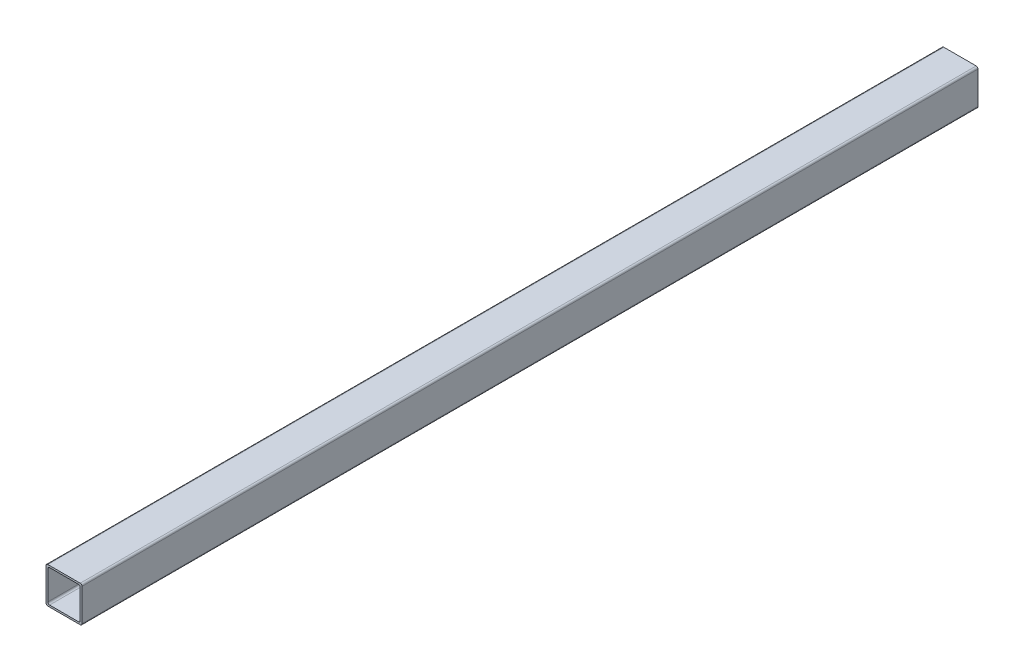
ISO-10303-21;
HEADER;
FILE_DESCRIPTION(('STEP AP214'),'2;1');
FILE_NAME('part.step','',(''),(''),'','','');
FILE_SCHEMA(('AUTOMOTIVE_DESIGN { 1 0 10303 214 1 1 1 1 }'));
ENDSEC;
DATA;
#1=APPLICATION_CONTEXT('core data for automotive mechanical design processes');
#2=APPLICATION_PROTOCOL_DEFINITION('international standard','automotive_design',2000,#1);
#3=PRODUCT_CONTEXT('',#1,'mechanical');
#4=PRODUCT('Part','Part','',(#3));
#5=PRODUCT_RELATED_PRODUCT_CATEGORY('part','',(#4));
#6=PRODUCT_DEFINITION_FORMATION('','',#4);
#7=PRODUCT_DEFINITION_CONTEXT('part definition',#1,'design');
#8=PRODUCT_DEFINITION('design','',#6,#7);
#9=PRODUCT_DEFINITION_SHAPE('','',#8);
#10=(LENGTH_UNIT() NAMED_UNIT(*) SI_UNIT(.MILLI.,.METRE.));
#11=(NAMED_UNIT(*) PLANE_ANGLE_UNIT() SI_UNIT($,.RADIAN.));
#12=(NAMED_UNIT(*) SI_UNIT($,.STERADIAN.) SOLID_ANGLE_UNIT());
#13=UNCERTAINTY_MEASURE_WITH_UNIT(LENGTH_MEASURE(1.E-05),#10,'distance_accuracy_value','');
#14=(GEOMETRIC_REPRESENTATION_CONTEXT(3) GLOBAL_UNCERTAINTY_ASSIGNED_CONTEXT((#13)) GLOBAL_UNIT_ASSIGNED_CONTEXT((#10,
#11,#12)) REPRESENTATION_CONTEXT('',''));
#15=CARTESIAN_POINT('',(0.,0.,0.));
#16=DIRECTION('',(0.,0.,1.));
#17=DIRECTION('',(1.,0.,0.));
#18=AXIS2_PLACEMENT_3D('',#15,#16,#17);
#19=CARTESIAN_POINT('',(18.,18.,995.));
#20=DIRECTION('',(0.,0.,-1.));
#21=DIRECTION('',(-1.,0.,0.));
#22=AXIS2_PLACEMENT_3D('',#19,#20,#21);
#23=PLANE('',#22);
#24=CARTESIAN_POINT('',(18.,18.,995.));
#25=DIRECTION('',(0.,0.,1.));
#26=DIRECTION('',(-1.,0.,0.));
#27=AXIS2_PLACEMENT_3D('',#24,#25,#26);
#28=CIRCLE('',#27,2.);
#29=CARTESIAN_POINT('',(20.,18.,995.));
#30=VERTEX_POINT('',#29);
#31=CARTESIAN_POINT('',(18.,20.,995.));
#32=VERTEX_POINT('',#31);
#33=EDGE_CURVE('E213',#30,#32,#28,.T.);
#34=ORIENTED_EDGE('',*,*,#33,.T.);
#35=DIRECTION('',(-1.,0.,0.));
#36=VECTOR('',#35,1.);
#37=CARTESIAN_POINT('',(-18.,20.,995.));
#38=LINE('',#37,#36);
#39=CARTESIAN_POINT('',(-18.,20.,995.));
#40=VERTEX_POINT('',#39);
#41=EDGE_CURVE('E216',#32,#40,#38,.T.);
#42=ORIENTED_EDGE('',*,*,#41,.T.);
#43=CARTESIAN_POINT('',(-18.,18.,995.));
#44=DIRECTION('',(0.,0.,1.));
#45=DIRECTION('',(1.,0.,0.));
#46=AXIS2_PLACEMENT_3D('',#43,#44,#45);
#47=CIRCLE('',#46,2.);
#48=CARTESIAN_POINT('',(-20.,18.,995.));
#49=VERTEX_POINT('',#48);
#50=EDGE_CURVE('E219',#40,#49,#47,.T.);
#51=ORIENTED_EDGE('',*,*,#50,.T.);
#52=DIRECTION('',(0.,-1.,0.));
#53=VECTOR('',#52,1.);
#54=CARTESIAN_POINT('',(-20.,18.,995.));
#55=LINE('',#54,#53);
#56=CARTESIAN_POINT('',(-20.,-18.,995.));
#57=VERTEX_POINT('',#56);
#58=EDGE_CURVE('E221',#49,#57,#55,.T.);
#59=ORIENTED_EDGE('',*,*,#58,.T.);
#60=CARTESIAN_POINT('',(-18.,-18.,995.));
#61=DIRECTION('',(0.,0.,1.));
#62=DIRECTION('',(1.,0.,0.));
#63=AXIS2_PLACEMENT_3D('',#60,#61,#62);
#64=CIRCLE('',#63,2.);
#65=CARTESIAN_POINT('',(-18.,-20.,995.));
#66=VERTEX_POINT('',#65);
#67=EDGE_CURVE('E223',#57,#66,#64,.T.);
#68=ORIENTED_EDGE('',*,*,#67,.T.);
#69=DIRECTION('',(1.,0.,0.));
#70=VECTOR('',#69,1.);
#71=CARTESIAN_POINT('',(-18.,-20.,995.));
#72=LINE('',#71,#70);
#73=CARTESIAN_POINT('',(18.,-20.,995.));
#74=VERTEX_POINT('',#73);
#75=EDGE_CURVE('E225',#66,#74,#72,.T.);
#76=ORIENTED_EDGE('',*,*,#75,.T.);
#77=CARTESIAN_POINT('',(18.,-18.,995.));
#78=DIRECTION('',(0.,0.,1.));
#79=DIRECTION('',(1.,0.,0.));
#80=AXIS2_PLACEMENT_3D('',#77,#78,#79);
#81=CIRCLE('',#80,2.);
#82=CARTESIAN_POINT('',(20.,-18.,995.));
#83=VERTEX_POINT('',#82);
#84=EDGE_CURVE('E227',#74,#83,#81,.T.);
#85=ORIENTED_EDGE('',*,*,#84,.T.);
#86=DIRECTION('',(0.,1.,0.));
#87=VECTOR('',#86,1.);
#88=CARTESIAN_POINT('',(20.,18.,995.));
#89=LINE('',#88,#87);
#90=EDGE_CURVE('E229',#83,#30,#89,.T.);
#91=ORIENTED_EDGE('',*,*,#90,.T.);
#92=EDGE_LOOP('',(#34,#42,#51,#59,#68,#76,#85,#91));
#93=FACE_BOUND('',#92,.T.);
#94=CARTESIAN_POINT('',(16.,16.,995.));
#95=DIRECTION('',(0.,0.,1.));
#96=DIRECTION('',(1.,0.,0.));
#97=AXIS2_PLACEMENT_3D('',#94,#95,#96);
#98=CIRCLE('',#97,2.);
#99=CARTESIAN_POINT('',(18.,16.,995.));
#100=VERTEX_POINT('',#99);
#101=CARTESIAN_POINT('',(16.,18.,995.));
#102=VERTEX_POINT('',#101);
#103=EDGE_CURVE('E148',#100,#102,#98,.T.);
#104=ORIENTED_EDGE('',*,*,#103,.F.);
#105=DIRECTION('',(0.,1.,0.));
#106=VECTOR('',#105,1.);
#107=CARTESIAN_POINT('',(18.,-16.,995.));
#108=LINE('',#107,#106);
#109=CARTESIAN_POINT('',(18.,-16.,995.));
#110=VERTEX_POINT('',#109);
#111=EDGE_CURVE('E181',#110,#100,#108,.T.);
#112=ORIENTED_EDGE('',*,*,#111,.F.);
#113=CARTESIAN_POINT('',(16.,-16.,995.));
#114=DIRECTION('',(0.,0.,1.));
#115=DIRECTION('',(1.,0.,0.));
#116=AXIS2_PLACEMENT_3D('',#113,#114,#115);
#117=CIRCLE('',#116,2.);
#118=CARTESIAN_POINT('',(16.,-18.,995.));
#119=VERTEX_POINT('',#118);
#120=EDGE_CURVE('E179',#119,#110,#117,.T.);
#121=ORIENTED_EDGE('',*,*,#120,.F.);
#122=DIRECTION('',(1.,0.,0.));
#123=VECTOR('',#122,1.);
#124=CARTESIAN_POINT('',(16.,-18.,995.));
#125=LINE('',#124,#123);
#126=CARTESIAN_POINT('',(-16.,-18.,995.));
#127=VERTEX_POINT('',#126);
#128=EDGE_CURVE('E177',#127,#119,#125,.T.);
#129=ORIENTED_EDGE('',*,*,#128,.F.);
#130=CARTESIAN_POINT('',(-16.,-16.,995.));
#131=DIRECTION('',(0.,0.,1.));
#132=DIRECTION('',(-1.,0.,0.));
#133=AXIS2_PLACEMENT_3D('',#130,#131,#132);
#134=CIRCLE('',#133,2.);
#135=CARTESIAN_POINT('',(-18.,-16.,995.));
#136=VERTEX_POINT('',#135);
#137=EDGE_CURVE('E175',#136,#127,#134,.T.);
#138=ORIENTED_EDGE('',*,*,#137,.F.);
#139=DIRECTION('',(0.,-1.,0.));
#140=VECTOR('',#139,1.);
#141=CARTESIAN_POINT('',(-18.,-16.,995.));
#142=LINE('',#141,#140);
#143=CARTESIAN_POINT('',(-18.,16.,995.));
#144=VERTEX_POINT('',#143);
#145=EDGE_CURVE('E171',#144,#136,#142,.T.);
#146=ORIENTED_EDGE('',*,*,#145,.F.);
#147=CARTESIAN_POINT('',(-16.,16.,995.));
#148=DIRECTION('',(0.,0.,1.));
#149=DIRECTION('',(1.,0.,0.));
#150=AXIS2_PLACEMENT_3D('',#147,#148,#149);
#151=CIRCLE('',#150,2.);
#152=CARTESIAN_POINT('',(-16.,18.,995.));
#153=VERTEX_POINT('',#152);
#154=EDGE_CURVE('E169',#153,#144,#151,.T.);
#155=ORIENTED_EDGE('',*,*,#154,.F.);
#156=DIRECTION('',(-1.,0.,0.));
#157=VECTOR('',#156,1.);
#158=CARTESIAN_POINT('',(16.,18.,995.));
#159=LINE('',#158,#157);
#160=EDGE_CURVE('E156',#102,#153,#159,.T.);
#161=ORIENTED_EDGE('',*,*,#160,.F.);
#162=EDGE_LOOP('',(#104,#112,#121,#129,#138,#146,#155,#161));
#163=FACE_BOUND('',#162,.T.);
#164=ADVANCED_FACE('F35',(#93,#163),#23,.F.);
#165=CARTESIAN_POINT('',(18.,18.,0.));
#166=DIRECTION('',(0.,0.,-1.));
#167=DIRECTION('',(-1.,0.,0.));
#168=AXIS2_PLACEMENT_3D('',#165,#166,#167);
#169=PLANE('',#168);
#170=CARTESIAN_POINT('',(18.,18.,0.));
#171=DIRECTION('',(0.,0.,1.));
#172=DIRECTION('',(-1.,0.,0.));
#173=AXIS2_PLACEMENT_3D('',#170,#171,#172);
#174=CIRCLE('',#173,2.);
#175=CARTESIAN_POINT('',(20.,18.,0.));
#176=VERTEX_POINT('',#175);
#177=CARTESIAN_POINT('',(18.,20.,0.));
#178=VERTEX_POINT('',#177);
#179=EDGE_CURVE('E164',#176,#178,#174,.T.);
#180=ORIENTED_EDGE('',*,*,#179,.F.);
#181=DIRECTION('',(0.,1.,0.));
#182=VECTOR('',#181,1.);
#183=CARTESIAN_POINT('',(20.,18.,0.));
#184=LINE('',#183,#182);
#185=CARTESIAN_POINT('',(20.,-18.,0.));
#186=VERTEX_POINT('',#185);
#187=EDGE_CURVE('E217',#186,#176,#184,.T.);
#188=ORIENTED_EDGE('',*,*,#187,.F.);
#189=CARTESIAN_POINT('',(18.,-18.,0.));
#190=DIRECTION('',(0.,0.,1.));
#191=DIRECTION('',(1.,0.,0.));
#192=AXIS2_PLACEMENT_3D('',#189,#190,#191);
#193=CIRCLE('',#192,2.);
#194=CARTESIAN_POINT('',(18.,-20.,0.));
#195=VERTEX_POINT('',#194);
#196=EDGE_CURVE('E244',#195,#186,#193,.T.);
#197=ORIENTED_EDGE('',*,*,#196,.F.);
#198=DIRECTION('',(1.,0.,0.));
#199=VECTOR('',#198,1.);
#200=CARTESIAN_POINT('',(-18.,-20.,0.));
#201=LINE('',#200,#199);
#202=CARTESIAN_POINT('',(-18.,-20.,0.));
#203=VERTEX_POINT('',#202);
#204=EDGE_CURVE('E242',#203,#195,#201,.T.);
#205=ORIENTED_EDGE('',*,*,#204,.F.);
#206=CARTESIAN_POINT('',(-18.,-18.,0.));
#207=DIRECTION('',(0.,0.,1.));
#208=DIRECTION('',(1.,0.,0.));
#209=AXIS2_PLACEMENT_3D('',#206,#207,#208);
#210=CIRCLE('',#209,2.);
#211=CARTESIAN_POINT('',(-20.,-18.,0.));
#212=VERTEX_POINT('',#211);
#213=EDGE_CURVE('E240',#212,#203,#210,.T.);
#214=ORIENTED_EDGE('',*,*,#213,.F.);
#215=DIRECTION('',(0.,-1.,0.));
#216=VECTOR('',#215,1.);
#217=CARTESIAN_POINT('',(-20.,18.,0.));
#218=LINE('',#217,#216);
#219=CARTESIAN_POINT('',(-20.,18.,0.));
#220=VERTEX_POINT('',#219);
#221=EDGE_CURVE('E238',#220,#212,#218,.T.);
#222=ORIENTED_EDGE('',*,*,#221,.F.);
#223=CARTESIAN_POINT('',(-18.,18.,0.));
#224=DIRECTION('',(0.,0.,1.));
#225=DIRECTION('',(1.,0.,0.));
#226=AXIS2_PLACEMENT_3D('',#223,#224,#225);
#227=CIRCLE('',#226,2.);
#228=CARTESIAN_POINT('',(-18.,20.,0.));
#229=VERTEX_POINT('',#228);
#230=EDGE_CURVE('E236',#229,#220,#227,.T.);
#231=ORIENTED_EDGE('',*,*,#230,.F.);
#232=DIRECTION('',(-1.,0.,0.));
#233=VECTOR('',#232,1.);
#234=CARTESIAN_POINT('',(-18.,20.,0.));
#235=LINE('',#234,#233);
#236=EDGE_CURVE('E234',#178,#229,#235,.T.);
#237=ORIENTED_EDGE('',*,*,#236,.F.);
#238=EDGE_LOOP('',(#180,#188,#197,#205,#214,#222,#231,#237));
#239=FACE_BOUND('',#238,.T.);
#240=DIRECTION('',(0.,1.,0.));
#241=VECTOR('',#240,1.);
#242=CARTESIAN_POINT('',(18.,-16.,0.));
#243=LINE('',#242,#241);
#244=CARTESIAN_POINT('',(18.,-16.,0.));
#245=VERTEX_POINT('',#244);
#246=CARTESIAN_POINT('',(18.,16.,0.));
#247=VERTEX_POINT('',#246);
#248=EDGE_CURVE('E157',#245,#247,#243,.T.);
#249=ORIENTED_EDGE('',*,*,#248,.T.);
#250=CARTESIAN_POINT('',(16.,16.,0.));
#251=DIRECTION('',(0.,0.,1.));
#252=DIRECTION('',(1.,0.,0.));
#253=AXIS2_PLACEMENT_3D('',#250,#251,#252);
#254=CIRCLE('',#253,2.);
#255=CARTESIAN_POINT('',(16.,18.,0.));
#256=VERTEX_POINT('',#255);
#257=EDGE_CURVE('E58',#247,#256,#254,.T.);
#258=ORIENTED_EDGE('',*,*,#257,.T.);
#259=DIRECTION('',(-1.,0.,0.));
#260=VECTOR('',#259,1.);
#261=CARTESIAN_POINT('',(16.,18.,0.));
#262=LINE('',#261,#260);
#263=CARTESIAN_POINT('',(-16.,18.,0.));
#264=VERTEX_POINT('',#263);
#265=EDGE_CURVE('E163',#256,#264,#262,.T.);
#266=ORIENTED_EDGE('',*,*,#265,.T.);
#267=CARTESIAN_POINT('',(-16.,16.,0.));
#268=DIRECTION('',(0.,0.,1.));
#269=DIRECTION('',(1.,0.,0.));
#270=AXIS2_PLACEMENT_3D('',#267,#268,#269);
#271=CIRCLE('',#270,2.);
#272=CARTESIAN_POINT('',(-18.,16.,0.));
#273=VERTEX_POINT('',#272);
#274=EDGE_CURVE('E185',#264,#273,#271,.T.);
#275=ORIENTED_EDGE('',*,*,#274,.T.);
#276=DIRECTION('',(0.,-1.,0.));
#277=VECTOR('',#276,1.);
#278=CARTESIAN_POINT('',(-18.,-16.,0.));
#279=LINE('',#278,#277);
#280=CARTESIAN_POINT('',(-18.,-16.,0.));
#281=VERTEX_POINT('',#280);
#282=EDGE_CURVE('E188',#273,#281,#279,.T.);
#283=ORIENTED_EDGE('',*,*,#282,.T.);
#284=CARTESIAN_POINT('',(-16.,-16.,0.));
#285=DIRECTION('',(0.,0.,1.));
#286=DIRECTION('',(-1.,0.,0.));
#287=AXIS2_PLACEMENT_3D('',#284,#285,#286);
#288=CIRCLE('',#287,2.);
#289=CARTESIAN_POINT('',(-16.,-18.,0.));
#290=VERTEX_POINT('',#289);
#291=EDGE_CURVE('E191',#281,#290,#288,.T.);
#292=ORIENTED_EDGE('',*,*,#291,.T.);
#293=DIRECTION('',(1.,0.,0.));
#294=VECTOR('',#293,1.);
#295=CARTESIAN_POINT('',(16.,-18.,0.));
#296=LINE('',#295,#294);
#297=CARTESIAN_POINT('',(16.,-18.,0.));
#298=VERTEX_POINT('',#297);
#299=EDGE_CURVE('E194',#290,#298,#296,.T.);
#300=ORIENTED_EDGE('',*,*,#299,.T.);
#301=CARTESIAN_POINT('',(16.,-16.,0.));
#302=DIRECTION('',(0.,0.,1.));
#303=DIRECTION('',(1.,0.,0.));
#304=AXIS2_PLACEMENT_3D('',#301,#302,#303);
#305=CIRCLE('',#304,2.);
#306=EDGE_CURVE('E197',#298,#245,#305,.T.);
#307=ORIENTED_EDGE('',*,*,#306,.T.);
#308=EDGE_LOOP('',(#249,#258,#266,#275,#283,#292,#300,#307));
#309=FACE_BOUND('',#308,.T.);
#310=ADVANCED_FACE('F274',(#239,#309),#169,.T.);
#311=CARTESIAN_POINT('',(18.,18.,995.));
#312=DIRECTION('',(0.,0.,-1.));
#313=DIRECTION('',(-1.,0.,0.));
#314=AXIS2_PLACEMENT_3D('',#311,#312,#313);
#315=CYLINDRICAL_SURFACE('',#314,2.);
#316=ORIENTED_EDGE('',*,*,#179,.T.);
#317=DIRECTION('',(0.,0.,-1.));
#318=VECTOR('',#317,1.);
#319=CARTESIAN_POINT('',(18.,20.,995.));
#320=LINE('',#319,#318);
#321=EDGE_CURVE('E11',#32,#178,#320,.T.);
#322=ORIENTED_EDGE('',*,*,#321,.F.);
#323=ORIENTED_EDGE('',*,*,#33,.F.);
#324=DIRECTION('',(0.,0.,-1.));
#325=VECTOR('',#324,1.);
#326=CARTESIAN_POINT('',(20.,18.,995.));
#327=LINE('',#326,#325);
#328=EDGE_CURVE('E231',#30,#176,#327,.T.);
#329=ORIENTED_EDGE('',*,*,#328,.T.);
#330=EDGE_LOOP('',(#316,#322,#323,#329));
#331=FACE_BOUND('',#330,.T.);
#332=ADVANCED_FACE('F37',(#331),#315,.T.);
#333=CARTESIAN_POINT('',(-18.,20.,995.));
#334=DIRECTION('',(0.,-1.,0.));
#335=DIRECTION('',(0.,0.,-1.));
#336=AXIS2_PLACEMENT_3D('',#333,#334,#335);
#337=PLANE('',#336);
#338=ORIENTED_EDGE('',*,*,#236,.T.);
#339=DIRECTION('',(0.,0.,-1.));
#340=VECTOR('',#339,1.);
#341=CARTESIAN_POINT('',(-18.,20.,995.));
#342=LINE('',#341,#340);
#343=EDGE_CURVE('E43',#40,#229,#342,.T.);
#344=ORIENTED_EDGE('',*,*,#343,.F.);
#345=ORIENTED_EDGE('',*,*,#41,.F.);
#346=ORIENTED_EDGE('',*,*,#321,.T.);
#347=EDGE_LOOP('',(#338,#344,#345,#346));
#348=FACE_BOUND('',#347,.T.);
#349=ADVANCED_FACE('F291',(#348),#337,.F.);
#350=CARTESIAN_POINT('',(-18.,18.,995.));
#351=DIRECTION('',(0.,0.,-1.));
#352=DIRECTION('',(-1.,0.,0.));
#353=AXIS2_PLACEMENT_3D('',#350,#351,#352);
#354=CYLINDRICAL_SURFACE('',#353,2.);
#355=ORIENTED_EDGE('',*,*,#230,.T.);
#356=DIRECTION('',(0.,0.,-1.));
#357=VECTOR('',#356,1.);
#358=CARTESIAN_POINT('',(-20.,18.,995.));
#359=LINE('',#358,#357);
#360=EDGE_CURVE('E261',#49,#220,#359,.T.);
#361=ORIENTED_EDGE('',*,*,#360,.F.);
#362=ORIENTED_EDGE('',*,*,#50,.F.);
#363=ORIENTED_EDGE('',*,*,#343,.T.);
#364=EDGE_LOOP('',(#355,#361,#362,#363));
#365=FACE_BOUND('',#364,.T.);
#366=ADVANCED_FACE('F268',(#365),#354,.T.);
#367=CARTESIAN_POINT('',(-20.,18.,995.));
#368=DIRECTION('',(1.,0.,0.));
#369=DIRECTION('',(0.,0.,-1.));
#370=AXIS2_PLACEMENT_3D('',#367,#368,#369);
#371=PLANE('',#370);
#372=ORIENTED_EDGE('',*,*,#221,.T.);
#373=DIRECTION('',(0.,0.,-1.));
#374=VECTOR('',#373,1.);
#375=CARTESIAN_POINT('',(-20.,-18.,995.));
#376=LINE('',#375,#374);
#377=EDGE_CURVE('E258',#57,#212,#376,.T.);
#378=ORIENTED_EDGE('',*,*,#377,.F.);
#379=ORIENTED_EDGE('',*,*,#58,.F.);
#380=ORIENTED_EDGE('',*,*,#360,.T.);
#381=EDGE_LOOP('',(#372,#378,#379,#380));
#382=FACE_BOUND('',#381,.T.);
#383=ADVANCED_FACE('F280',(#382),#371,.F.);
#384=CARTESIAN_POINT('',(-18.,-18.,995.));
#385=DIRECTION('',(0.,0.,-1.));
#386=DIRECTION('',(-1.,0.,0.));
#387=AXIS2_PLACEMENT_3D('',#384,#385,#386);
#388=CYLINDRICAL_SURFACE('',#387,2.);
#389=ORIENTED_EDGE('',*,*,#213,.T.);
#390=DIRECTION('',(0.,0.,-1.));
#391=VECTOR('',#390,1.);
#392=CARTESIAN_POINT('',(-18.,-20.,995.));
#393=LINE('',#392,#391);
#394=EDGE_CURVE('E255',#66,#203,#393,.T.);
#395=ORIENTED_EDGE('',*,*,#394,.F.);
#396=ORIENTED_EDGE('',*,*,#67,.F.);
#397=ORIENTED_EDGE('',*,*,#377,.T.);
#398=EDGE_LOOP('',(#389,#395,#396,#397));
#399=FACE_BOUND('',#398,.T.);
#400=ADVANCED_FACE('F284',(#399),#388,.T.);
#401=CARTESIAN_POINT('',(-18.,-20.,995.));
#402=DIRECTION('',(0.,1.,0.));
#403=DIRECTION('',(0.,0.,1.));
#404=AXIS2_PLACEMENT_3D('',#401,#402,#403);
#405=PLANE('',#404);
#406=ORIENTED_EDGE('',*,*,#204,.T.);
#407=DIRECTION('',(0.,0.,-1.));
#408=VECTOR('',#407,1.);
#409=CARTESIAN_POINT('',(18.,-20.,995.));
#410=LINE('',#409,#408);
#411=EDGE_CURVE('E252',#74,#195,#410,.T.);
#412=ORIENTED_EDGE('',*,*,#411,.F.);
#413=ORIENTED_EDGE('',*,*,#75,.F.);
#414=ORIENTED_EDGE('',*,*,#394,.T.);
#415=EDGE_LOOP('',(#406,#412,#413,#414));
#416=FACE_BOUND('',#415,.T.);
#417=ADVANCED_FACE('F304',(#416),#405,.F.);
#418=CARTESIAN_POINT('',(18.,-18.,995.));
#419=DIRECTION('',(0.,0.,-1.));
#420=DIRECTION('',(-1.,0.,0.));
#421=AXIS2_PLACEMENT_3D('',#418,#419,#420);
#422=CYLINDRICAL_SURFACE('',#421,2.);
#423=ORIENTED_EDGE('',*,*,#196,.T.);
#424=DIRECTION('',(0.,0.,-1.));
#425=VECTOR('',#424,1.);
#426=CARTESIAN_POINT('',(20.,-18.,995.));
#427=LINE('',#426,#425);
#428=EDGE_CURVE('E249',#83,#186,#427,.T.);
#429=ORIENTED_EDGE('',*,*,#428,.F.);
#430=ORIENTED_EDGE('',*,*,#84,.F.);
#431=ORIENTED_EDGE('',*,*,#411,.T.);
#432=EDGE_LOOP('',(#423,#429,#430,#431));
#433=FACE_BOUND('',#432,.T.);
#434=ADVANCED_FACE('F302',(#433),#422,.T.);
#435=CARTESIAN_POINT('',(20.,18.,995.));
#436=DIRECTION('',(-1.,0.,0.));
#437=DIRECTION('',(0.,0.,1.));
#438=AXIS2_PLACEMENT_3D('',#435,#436,#437);
#439=PLANE('',#438);
#440=ORIENTED_EDGE('',*,*,#187,.T.);
#441=ORIENTED_EDGE('',*,*,#328,.F.);
#442=ORIENTED_EDGE('',*,*,#90,.F.);
#443=ORIENTED_EDGE('',*,*,#428,.T.);
#444=EDGE_LOOP('',(#440,#441,#442,#443));
#445=FACE_BOUND('',#444,.T.);
#446=ADVANCED_FACE('F297',(#445),#439,.F.);
#447=CARTESIAN_POINT('',(16.,16.,995.));
#448=DIRECTION('',(0.,0.,-1.));
#449=DIRECTION('',(-1.,0.,0.));
#450=AXIS2_PLACEMENT_3D('',#447,#448,#449);
#451=CYLINDRICAL_SURFACE('',#450,2.);
#452=ORIENTED_EDGE('',*,*,#257,.F.);
#453=DIRECTION('',(0.,0.,-1.));
#454=VECTOR('',#453,1.);
#455=CARTESIAN_POINT('',(18.,16.,995.));
#456=LINE('',#455,#454);
#457=EDGE_CURVE('E152',#100,#247,#456,.T.);
#458=ORIENTED_EDGE('',*,*,#457,.F.);
#459=ORIENTED_EDGE('',*,*,#103,.T.);
#460=DIRECTION('',(0.,0.,-1.));
#461=VECTOR('',#460,1.);
#462=CARTESIAN_POINT('',(16.,18.,995.));
#463=LINE('',#462,#461);
#464=EDGE_CURVE('E151',#102,#256,#463,.T.);
#465=ORIENTED_EDGE('',*,*,#464,.T.);
#466=EDGE_LOOP('',(#452,#458,#459,#465));
#467=FACE_BOUND('',#466,.T.);
#468=ADVANCED_FACE('F150',(#467),#451,.F.);
#469=CARTESIAN_POINT('',(16.,18.,995.));
#470=DIRECTION('',(0.,-1.,0.));
#471=DIRECTION('',(0.,0.,-1.));
#472=AXIS2_PLACEMENT_3D('',#469,#470,#471);
#473=PLANE('',#472);
#474=ORIENTED_EDGE('',*,*,#265,.F.);
#475=ORIENTED_EDGE('',*,*,#464,.F.);
#476=ORIENTED_EDGE('',*,*,#160,.T.);
#477=DIRECTION('',(0.,0.,-1.));
#478=VECTOR('',#477,1.);
#479=CARTESIAN_POINT('',(-16.,18.,995.));
#480=LINE('',#479,#478);
#481=EDGE_CURVE('E165',#153,#264,#480,.T.);
#482=ORIENTED_EDGE('',*,*,#481,.T.);
#483=EDGE_LOOP('',(#474,#475,#476,#482));
#484=FACE_BOUND('',#483,.T.);
#485=ADVANCED_FACE('F160',(#484),#473,.T.);
#486=CARTESIAN_POINT('',(-16.,16.,995.));
#487=DIRECTION('',(0.,0.,-1.));
#488=DIRECTION('',(-1.,0.,0.));
#489=AXIS2_PLACEMENT_3D('',#486,#487,#488);
#490=CYLINDRICAL_SURFACE('',#489,2.);
#491=ORIENTED_EDGE('',*,*,#274,.F.);
#492=ORIENTED_EDGE('',*,*,#481,.F.);
#493=ORIENTED_EDGE('',*,*,#154,.T.);
#494=DIRECTION('',(0.,0.,-1.));
#495=VECTOR('',#494,1.);
#496=CARTESIAN_POINT('',(-18.,16.,995.));
#497=LINE('',#496,#495);
#498=EDGE_CURVE('E210',#144,#273,#497,.T.);
#499=ORIENTED_EDGE('',*,*,#498,.T.);
#500=EDGE_LOOP('',(#491,#492,#493,#499));
#501=FACE_BOUND('',#500,.T.);
#502=ADVANCED_FACE('F329',(#501),#490,.F.);
#503=CARTESIAN_POINT('',(-18.,-16.,995.));
#504=DIRECTION('',(1.,0.,0.));
#505=DIRECTION('',(0.,0.,-1.));
#506=AXIS2_PLACEMENT_3D('',#503,#504,#505);
#507=PLANE('',#506);
#508=ORIENTED_EDGE('',*,*,#282,.F.);
#509=ORIENTED_EDGE('',*,*,#498,.F.);
#510=ORIENTED_EDGE('',*,*,#145,.T.);
#511=DIRECTION('',(0.,0.,-1.));
#512=VECTOR('',#511,1.);
#513=CARTESIAN_POINT('',(-18.,-16.,995.));
#514=LINE('',#513,#512);
#515=EDGE_CURVE('E208',#136,#281,#514,.T.);
#516=ORIENTED_EDGE('',*,*,#515,.T.);
#517=EDGE_LOOP('',(#508,#509,#510,#516));
#518=FACE_BOUND('',#517,.T.);
#519=ADVANCED_FACE('F333',(#518),#507,.T.);
#520=CARTESIAN_POINT('',(-16.,-16.,995.));
#521=DIRECTION('',(0.,0.,-1.));
#522=DIRECTION('',(-1.,0.,0.));
#523=AXIS2_PLACEMENT_3D('',#520,#521,#522);
#524=CYLINDRICAL_SURFACE('',#523,2.);
#525=ORIENTED_EDGE('',*,*,#291,.F.);
#526=ORIENTED_EDGE('',*,*,#515,.F.);
#527=ORIENTED_EDGE('',*,*,#137,.T.);
#528=DIRECTION('',(0.,0.,-1.));
#529=VECTOR('',#528,1.);
#530=CARTESIAN_POINT('',(-16.,-18.,995.));
#531=LINE('',#530,#529);
#532=EDGE_CURVE('E206',#127,#290,#531,.T.);
#533=ORIENTED_EDGE('',*,*,#532,.T.);
#534=EDGE_LOOP('',(#525,#526,#527,#533));
#535=FACE_BOUND('',#534,.T.);
#536=ADVANCED_FACE('F339',(#535),#524,.F.);
#537=CARTESIAN_POINT('',(16.,-18.,995.));
#538=DIRECTION('',(0.,1.,0.));
#539=DIRECTION('',(0.,0.,1.));
#540=AXIS2_PLACEMENT_3D('',#537,#538,#539);
#541=PLANE('',#540);
#542=ORIENTED_EDGE('',*,*,#299,.F.);
#543=ORIENTED_EDGE('',*,*,#532,.F.);
#544=ORIENTED_EDGE('',*,*,#128,.T.);
#545=DIRECTION('',(0.,0.,-1.));
#546=VECTOR('',#545,1.);
#547=CARTESIAN_POINT('',(16.,-18.,995.));
#548=LINE('',#547,#546);
#549=EDGE_CURVE('E204',#119,#298,#548,.T.);
#550=ORIENTED_EDGE('',*,*,#549,.T.);
#551=EDGE_LOOP('',(#542,#543,#544,#550));
#552=FACE_BOUND('',#551,.T.);
#553=ADVANCED_FACE('F343',(#552),#541,.T.);
#554=CARTESIAN_POINT('',(16.,-16.,995.));
#555=DIRECTION('',(0.,0.,-1.));
#556=DIRECTION('',(-1.,0.,0.));
#557=AXIS2_PLACEMENT_3D('',#554,#555,#556);
#558=CYLINDRICAL_SURFACE('',#557,2.);
#559=ORIENTED_EDGE('',*,*,#306,.F.);
#560=ORIENTED_EDGE('',*,*,#549,.F.);
#561=ORIENTED_EDGE('',*,*,#120,.T.);
#562=DIRECTION('',(0.,0.,-1.));
#563=VECTOR('',#562,1.);
#564=CARTESIAN_POINT('',(18.,-16.,995.));
#565=LINE('',#564,#563);
#566=EDGE_CURVE('E50',#110,#245,#565,.T.);
#567=ORIENTED_EDGE('',*,*,#566,.T.);
#568=EDGE_LOOP('',(#559,#560,#561,#567));
#569=FACE_BOUND('',#568,.T.);
#570=ADVANCED_FACE('F347',(#569),#558,.F.);
#571=CARTESIAN_POINT('',(18.,-16.,995.));
#572=DIRECTION('',(-1.,0.,0.));
#573=DIRECTION('',(0.,0.,1.));
#574=AXIS2_PLACEMENT_3D('',#571,#572,#573);
#575=PLANE('',#574);
#576=ORIENTED_EDGE('',*,*,#248,.F.);
#577=ORIENTED_EDGE('',*,*,#566,.F.);
#578=ORIENTED_EDGE('',*,*,#111,.T.);
#579=ORIENTED_EDGE('',*,*,#457,.T.);
#580=EDGE_LOOP('',(#576,#577,#578,#579));
#581=FACE_BOUND('',#580,.T.);
#582=ADVANCED_FACE('F351',(#581),#575,.T.);
#583=CLOSED_SHELL('',(#164,#310,#332,#349,#366,#383,#400,#417,#434,#446,#468,#485,#502,#519,
#536,#553,#570,#582));
#584=MANIFOLD_SOLID_BREP('B2',#583);
#585=ADVANCED_BREP_SHAPE_REPRESENTATION('',(#18,#584),#14);
#586=SHAPE_DEFINITION_REPRESENTATION(#9,#585);
ENDSEC;
END-ISO-10303-21;
